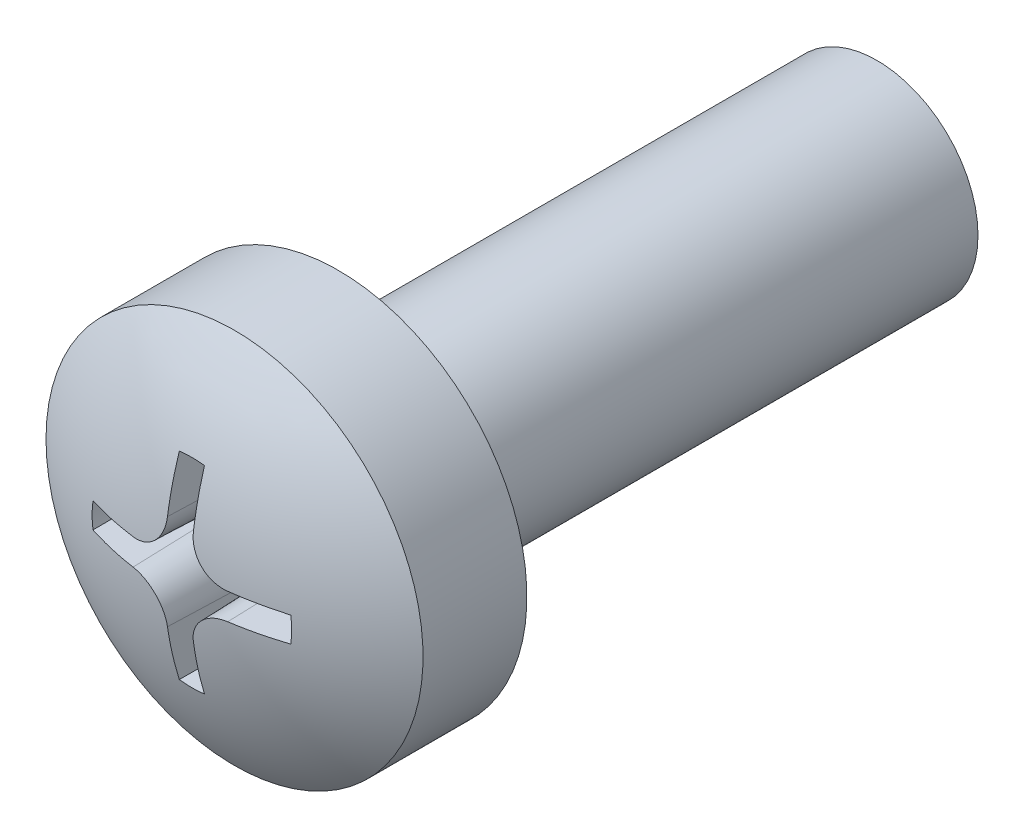
ISO-10303-21;
HEADER;
FILE_DESCRIPTION(('STEP AP214'),'2;1');
FILE_NAME('part.step','',(''),(''),'','','');
FILE_SCHEMA(('AUTOMOTIVE_DESIGN { 1 0 10303 214 1 1 1 1 }'));
ENDSEC;
DATA;
#1=APPLICATION_CONTEXT('core data for automotive mechanical design processes');
#2=APPLICATION_PROTOCOL_DEFINITION('international standard','automotive_design',2000,#1);
#3=PRODUCT_CONTEXT('',#1,'mechanical');
#4=PRODUCT('Part','Part','',(#3));
#5=PRODUCT_RELATED_PRODUCT_CATEGORY('part','',(#4));
#6=PRODUCT_DEFINITION_FORMATION('','',#4);
#7=PRODUCT_DEFINITION_CONTEXT('part definition',#1,'design');
#8=PRODUCT_DEFINITION('design','',#6,#7);
#9=PRODUCT_DEFINITION_SHAPE('','',#8);
#10=(LENGTH_UNIT() NAMED_UNIT(*) SI_UNIT(.MILLI.,.METRE.));
#11=(NAMED_UNIT(*) PLANE_ANGLE_UNIT() SI_UNIT($,.RADIAN.));
#12=(NAMED_UNIT(*) SI_UNIT($,.STERADIAN.) SOLID_ANGLE_UNIT());
#13=UNCERTAINTY_MEASURE_WITH_UNIT(LENGTH_MEASURE(1.E-05),#10,'distance_accuracy_value','');
#14=(GEOMETRIC_REPRESENTATION_CONTEXT(3) GLOBAL_UNCERTAINTY_ASSIGNED_CONTEXT((#13)) GLOBAL_UNIT_ASSIGNED_CONTEXT((#10,
#11,#12)) REPRESENTATION_CONTEXT('',''));
#15=CARTESIAN_POINT('',(0.,0.,0.));
#16=DIRECTION('',(0.,0.,1.));
#17=DIRECTION('',(1.,0.,0.));
#18=AXIS2_PLACEMENT_3D('',#15,#16,#17);
#19=CARTESIAN_POINT('',(0.,0.,8.));
#20=DIRECTION('',(0.,0.,-1.));
#21=DIRECTION('',(-1.,0.,0.));
#22=AXIS2_PLACEMENT_3D('',#19,#20,#21);
#23=CYLINDRICAL_SURFACE('',#22,1.5);
#24=CARTESIAN_POINT('',(0.,0.,8.));
#25=DIRECTION('',(0.,0.,1.));
#26=DIRECTION('',(1.,0.,0.));
#27=AXIS2_PLACEMENT_3D('',#24,#25,#26);
#28=CIRCLE('',#27,1.5);
#29=CARTESIAN_POINT('',(1.5,0.,8.));
#30=VERTEX_POINT('',#29);
#31=EDGE_CURVE('E206',#30,#30,#28,.T.);
#32=ORIENTED_EDGE('',*,*,#31,.F.);
#33=EDGE_LOOP('',(#32));
#34=FACE_BOUND('',#33,.T.);
#35=CARTESIAN_POINT('',(0.,0.,0.));
#36=DIRECTION('',(0.,0.,1.));
#37=DIRECTION('',(1.,0.,0.));
#38=AXIS2_PLACEMENT_3D('',#35,#36,#37);
#39=CIRCLE('',#38,1.5);
#40=CARTESIAN_POINT('',(1.5,0.,0.));
#41=VERTEX_POINT('',#40);
#42=EDGE_CURVE('E205',#41,#41,#39,.T.);
#43=ORIENTED_EDGE('',*,*,#42,.T.);
#44=EDGE_LOOP('',(#43));
#45=FACE_BOUND('',#44,.T.);
#46=ADVANCED_FACE('F34',(#34,#45),#23,.T.);
#47=CARTESIAN_POINT('',(0.,0.,0.));
#48=DIRECTION('',(0.,0.,1.));
#49=DIRECTION('',(1.,0.,0.));
#50=AXIS2_PLACEMENT_3D('',#47,#48,#49);
#51=PLANE('',#50);
#52=ORIENTED_EDGE('',*,*,#42,.F.);
#53=EDGE_LOOP('',(#52));
#54=FACE_BOUND('',#53,.T.);
#55=ADVANCED_FACE('F291',(#54),#51,.F.);
#56=CARTESIAN_POINT('',(0.,0.,8.));
#57=DIRECTION('',(0.,0.,-1.));
#58=DIRECTION('',(-1.,0.,0.));
#59=AXIS2_PLACEMENT_3D('',#56,#57,#58);
#60=PLANE('',#59);
#61=CARTESIAN_POINT('',(0.,0.,8.));
#62=DIRECTION('',(0.,0.,-1.));
#63=DIRECTION('',(-1.,0.,0.));
#64=AXIS2_PLACEMENT_3D('',#61,#62,#63);
#65=CIRCLE('',#64,2.79999990016222);
#66=CARTESIAN_POINT('',(-2.79999990016222,0.,8.));
#67=VERTEX_POINT('',#66);
#68=EDGE_CURVE('E202',#67,#67,#65,.T.);
#69=ORIENTED_EDGE('',*,*,#68,.T.);
#70=EDGE_LOOP('',(#69));
#71=FACE_BOUND('',#70,.T.);
#72=ORIENTED_EDGE('',*,*,#31,.T.);
#73=EDGE_LOOP('',(#72));
#74=FACE_BOUND('',#73,.T.);
#75=ADVANCED_FACE('F296',(#71,#74),#60,.T.);
#76=CARTESIAN_POINT('',(0.,0.,-0.393620134621003));
#77=DIRECTION('',(0.,0.,-1.));
#78=DIRECTION('',(-1.,0.,0.));
#79=AXIS2_PLACEMENT_3D('',#76,#77,#78);
#80=CYLINDRICAL_SURFACE('',#79,2.79999990016222);
#81=CARTESIAN_POINT('',(0.,0.,9.54246307978926));
#82=DIRECTION('',(0.,0.,-1.));
#83=DIRECTION('',(-1.,0.,0.));
#84=AXIS2_PLACEMENT_3D('',#81,#82,#83);
#85=CIRCLE('',#84,2.79999990016222);
#86=CARTESIAN_POINT('',(-2.79999990016222,0.,9.54246307978926));
#87=VERTEX_POINT('',#86);
#88=EDGE_CURVE('E150',#87,#87,#85,.T.);
#89=ORIENTED_EDGE('',*,*,#88,.T.);
#90=EDGE_LOOP('',(#89));
#91=FACE_BOUND('',#90,.T.);
#92=ORIENTED_EDGE('',*,*,#68,.F.);
#93=EDGE_LOOP('',(#92));
#94=FACE_BOUND('',#93,.T.);
#95=ADVANCED_FACE('F303',(#91,#94),#80,.T.);
#96=CARTESIAN_POINT('',(0.,0.,5.40000011175871));
#97=DIRECTION('',(0.,0.,-1.));
#98=DIRECTION('',(1.,0.,0.));
#99=AXIS2_PLACEMENT_3D('',#96,#97,#98);
#100=SPHERICAL_SURFACE('',#99,4.99999988824129);
#101=CARTESIAN_POINT('',(0.,0.,10.1754183821502));
#102=DIRECTION('',(0.,0.,-1.));
#103=DIRECTION('',(-1.,0.,0.));
#104=AXIS2_PLACEMENT_3D('',#101,#102,#103);
#105=CIRCLE('',#104,1.4816812157899);
#106=CARTESIAN_POINT('',(0.18668120666759,1.46987392394782,10.1754183821501));
#107=VERTEX_POINT('',#106);
#108=CARTESIAN_POINT('',(-0.186681206667593,1.46987392394782,10.1754183821501));
#109=VERTEX_POINT('',#108);
#110=EDGE_CURVE('E11',#107,#109,#105,.F.);
#111=ORIENTED_EDGE('',*,*,#110,.F.);
#112=CARTESIAN_POINT('',(0.0198956640512633,0.,5.39930533986049));
#113=DIRECTION('',(0.999390827019096,0.,-0.034899496702501));
#114=DIRECTION('',(-0.034899496702501,0.,-0.999390827019096));
#115=AXIS2_PLACEMENT_3D('',#112,#113,#114);
#116=CIRCLE('',#115,4.99996025606773);
#117=CARTESIAN_POINT('',(0.192632610704328,0.708178557647151,10.3458442955351));
#118=VERTEX_POINT('',#117);
#119=EDGE_CURVE('E41',#107,#118,#116,.T.);
#120=ORIENTED_EDGE('',*,*,#119,.T.);
#121=CARTESIAN_POINT('',(0.192631650862954,0.708378557647151,10.345815691475));
#122=CARTESIAN_POINT('',(0.192737639690806,0.679822741796073,10.3499041439734));
#123=CARTESIAN_POINT('',(0.195268867839181,0.651227392830896,10.3536463362414));
#124=CARTESIAN_POINT('',(0.205046889209158,0.59476703827459,10.3603460551712));
#125=CARTESIAN_POINT('',(0.212292618678018,0.566901869404939,10.3633037586285));
#126=CARTESIAN_POINT('',(0.231373694375068,0.51267267841366,10.3683466063254));
#127=CARTESIAN_POINT('',(0.24321326807329,0.486310064716558,10.3704309431667));
#128=CARTESIAN_POINT('',(0.271156607880554,0.435900324544809,10.3736603491012));
#129=CARTESIAN_POINT('',(0.287258672100205,0.411852279143786,10.3748057923215));
#130=CARTESIAN_POINT('',(0.323072075489885,0.367028886470806,10.3761158025717));
#131=CARTESIAN_POINT('',(0.342740648168188,0.346219679514825,10.3762912893596));
#132=CARTESIAN_POINT('',(0.385246757538768,0.30814670944778,10.3756853456951));
#133=CARTESIAN_POINT('',(0.408084792807392,0.290883505206881,10.3749037645383));
#134=CARTESIAN_POINT('',(0.456147210008961,0.260464262414973,10.3724133951705));
#135=CARTESIAN_POINT('',(0.481359759209805,0.247289131136679,10.3707090224733));
#136=CARTESIAN_POINT('',(0.533541444049374,0.225283958921734,10.3664258870809));
#137=CARTESIAN_POINT('',(0.560509920861877,0.216452298826715,10.3638474508254));
#138=CARTESIAN_POINT('',(0.606876295057338,0.205379627868596,10.3588207651558));
#139=CARTESIAN_POINT('',(0.626020977094074,0.201943221890059,10.3565812960749));
#140=CARTESIAN_POINT('',(0.66450204404321,0.197253494550336,10.3517582366185));
#141=CARTESIAN_POINT('',(0.683838077649067,0.195996727127303,10.349175196413));
#142=CARTESIAN_POINT('',(0.703167546290468,0.195835015722445,10.3464334662955));
#143=B_SPLINE_CURVE_WITH_KNOTS('',3,(#121,#122,#123,#124,#125,#126,#127,#128,#129,#130,#131,
#132,#133,#134,#135,#136,#137,#138,#139,#140,#141,#142),.UNSPECIFIED.,.F.,.F.,(4,2,2,2,2,2,2,2,
2,2,4),(0.,0.0864417829586744,0.172864068455127,0.259366073122684,0.345833591994609,
0.431325646912079,0.516831165542016,0.601931114274005,0.686999315371811,0.745618262708562,
0.804144447281415),.UNSPECIFIED.);
#144=CARTESIAN_POINT('',(0.702917362553185,0.19583721033533,10.3464689381926));
#145=VERTEX_POINT('',#144);
#146=EDGE_CURVE('E274',#118,#145,#143,.T.);
#147=ORIENTED_EDGE('',*,*,#146,.T.);
#148=CARTESIAN_POINT('',(0.00010539015335094,0.0259265633149154,5.39909472873738));
#149=DIRECTION('',(0.00406243901494415,0.999382570249833,-0.034899496702501));
#150=DIRECTION('',(0.,0.0348997846864301,0.999390816962434));
#151=AXIS2_PLACEMENT_3D('',#148,#149,#150);
#152=CIRCLE('',#151,4.99993258603575);
#153=CARTESIAN_POINT('',(1.46986565043204,0.186746338396853,10.1754183821502));
#154=VERTEX_POINT('',#153);
#155=EDGE_CURVE('E272',#154,#145,#152,.F.);
#156=ORIENTED_EDGE('',*,*,#155,.F.);
#157=CARTESIAN_POINT('',(0.,0.,10.1754183821502));
#158=DIRECTION('',(0.,0.,-1.));
#159=DIRECTION('',(-1.,0.,0.));
#160=AXIS2_PLACEMENT_3D('',#157,#158,#159);
#161=CIRCLE('',#160,1.4816812157899);
#162=CARTESIAN_POINT('',(1.46986565043204,-0.186746338396852,10.1754183821501));
#163=VERTEX_POINT('',#162);
#164=EDGE_CURVE('E270',#163,#154,#161,.F.);
#165=ORIENTED_EDGE('',*,*,#164,.F.);
#166=CARTESIAN_POINT('',(0.000105390153350971,-0.0259265633149169,5.39909472873738));
#167=DIRECTION('',(0.00406243901494512,-0.999382570249833,-0.034899496702501));
#168=DIRECTION('',(0.,0.0348997846864301,-0.999390816962434));
#169=AXIS2_PLACEMENT_3D('',#166,#167,#168);
#170=CIRCLE('',#169,4.99993258603575);
#171=CARTESIAN_POINT('',(0.702917362553185,-0.195837210335331,10.3464689381926));
#172=VERTEX_POINT('',#171);
#173=EDGE_CURVE('E267',#163,#172,#170,.T.);
#174=ORIENTED_EDGE('',*,*,#173,.T.);
#175=CARTESIAN_POINT('',(0.192631650862954,-0.708378557647152,10.345815691475));
#176=CARTESIAN_POINT('',(0.192737639690806,-0.679822741796074,10.3499041439734));
#177=CARTESIAN_POINT('',(0.195268867839181,-0.651227392830896,10.3536463362414));
#178=CARTESIAN_POINT('',(0.205046889209158,-0.59476703827459,10.3603460551712));
#179=CARTESIAN_POINT('',(0.212292618678018,-0.56690186940494,10.3633037586285));
#180=CARTESIAN_POINT('',(0.231373694375068,-0.512672678413661,10.3683466063254));
#181=CARTESIAN_POINT('',(0.24321326807329,-0.486310064716559,10.3704309431667));
#182=CARTESIAN_POINT('',(0.271156607880554,-0.435900324544809,10.3736603491012));
#183=CARTESIAN_POINT('',(0.287258672100205,-0.411852279143786,10.3748057923215));
#184=CARTESIAN_POINT('',(0.323072075489885,-0.367028886470807,10.3761158025717));
#185=CARTESIAN_POINT('',(0.342740648168188,-0.346219679514826,10.3762912893596));
#186=CARTESIAN_POINT('',(0.385246757538768,-0.308146709447781,10.3756853456951));
#187=CARTESIAN_POINT('',(0.408084792807392,-0.290883505206882,10.3749037645383));
#188=CARTESIAN_POINT('',(0.456147210008961,-0.260464262414974,10.3724133951705));
#189=CARTESIAN_POINT('',(0.481359759209805,-0.247289131136679,10.3707090224733));
#190=CARTESIAN_POINT('',(0.533541444049374,-0.225283958921735,10.3664258870809));
#191=CARTESIAN_POINT('',(0.560509920861878,-0.216452298826716,10.3638474508254));
#192=CARTESIAN_POINT('',(0.606876295057338,-0.205379627868597,10.3588207651558));
#193=CARTESIAN_POINT('',(0.626020977094074,-0.201943221890059,10.3565812960749));
#194=CARTESIAN_POINT('',(0.66450204404321,-0.197253494550336,10.3517582366185));
#195=CARTESIAN_POINT('',(0.683838077649067,-0.195996727127304,10.349175196413));
#196=CARTESIAN_POINT('',(0.703167546290467,-0.195835015722445,10.3464334662955));
#197=B_SPLINE_CURVE_WITH_KNOTS('',3,(#175,#176,#177,#178,#179,#180,#181,#182,#183,#184,#185,
#186,#187,#188,#189,#190,#191,#192,#193,#194,#195,#196),.UNSPECIFIED.,.F.,.F.,(4,2,2,2,2,2,2,2,
2,2,4),(0.,0.0864417829586745,0.172864068455127,0.259366073122684,0.345833591994609,
0.431325646912079,0.516831165542017,0.601931114274005,0.686999315371811,0.745618262708562,
0.804144447281414),.UNSPECIFIED.);
#198=CARTESIAN_POINT('',(0.192632610704328,-0.708178557647152,10.3458442955351));
#199=VERTEX_POINT('',#198);
#200=EDGE_CURVE('E262',#199,#172,#197,.T.);
#201=ORIENTED_EDGE('',*,*,#200,.F.);
#202=CARTESIAN_POINT('',(0.0198956640512633,0.,5.39930533986049));
#203=DIRECTION('',(0.999390827019096,0.,-0.034899496702501));
#204=DIRECTION('',(-0.034899496702501,0.,-0.999390827019096));
#205=AXIS2_PLACEMENT_3D('',#202,#203,#204);
#206=CIRCLE('',#205,4.99996025606773);
#207=CARTESIAN_POINT('',(0.186681206667591,-1.46987392394782,10.1754183821502));
#208=VERTEX_POINT('',#207);
#209=EDGE_CURVE('E260',#208,#199,#206,.F.);
#210=ORIENTED_EDGE('',*,*,#209,.F.);
#211=CARTESIAN_POINT('',(0.,0.,10.1754183821502));
#212=DIRECTION('',(0.,0.,-1.));
#213=DIRECTION('',(-1.,0.,0.));
#214=AXIS2_PLACEMENT_3D('',#211,#212,#213);
#215=CIRCLE('',#214,1.4816812157899);
#216=CARTESIAN_POINT('',(-0.186681206667593,-1.46987392394782,10.1754183821501));
#217=VERTEX_POINT('',#216);
#218=EDGE_CURVE('E257',#208,#217,#215,.T.);
#219=ORIENTED_EDGE('',*,*,#218,.T.);
#220=CARTESIAN_POINT('',(-0.0198956640512654,0.,5.39930533986049));
#221=DIRECTION('',(-0.999390827019096,0.,-0.034899496702501));
#222=DIRECTION('',(-0.034899496702501,0.,0.999390827019096));
#223=AXIS2_PLACEMENT_3D('',#220,#221,#222);
#224=CIRCLE('',#223,4.99996025606773);
#225=CARTESIAN_POINT('',(-0.19263261070433,-0.708178557647151,10.3458442955351));
#226=VERTEX_POINT('',#225);
#227=EDGE_CURVE('E253',#217,#226,#224,.T.);
#228=ORIENTED_EDGE('',*,*,#227,.T.);
#229=CARTESIAN_POINT('',(-0.70316754629047,-0.195835015722445,10.3464334662955));
#230=CARTESIAN_POINT('',(-0.674619447950853,-0.196052963217916,10.3504857241648));
#231=CARTESIAN_POINT('',(-0.64604143463723,-0.198695168407334,10.3541890416191));
#232=CARTESIAN_POINT('',(-0.589634494727846,-0.208689654905481,10.3608068014756));
#233=CARTESIAN_POINT('',(-0.561805393198953,-0.216040826152062,10.3637214295682));
#234=CARTESIAN_POINT('',(-0.50766612082123,-0.235323893103952,10.3686750861046));
#235=CARTESIAN_POINT('',(-0.481357369172765,-0.247259991703852,10.370713307523));
#236=CARTESIAN_POINT('',(-0.431071022991569,-0.275383990623327,10.3738489099634));
#237=CARTESIAN_POINT('',(-0.407092510169895,-0.291570206692358,10.3749466629444));
#238=CARTESIAN_POINT('',(-0.362416703115867,-0.327538701485094,10.3761618083202));
#239=CARTESIAN_POINT('',(-0.34168588735275,-0.347278991317759,10.376289966384));
#240=CARTESIAN_POINT('',(-0.303780328011577,-0.389912448398922,10.375590364716));
#241=CARTESIAN_POINT('',(-0.286606147147997,-0.412806113607388,10.3747624538554));
#242=CARTESIAN_POINT('',(-0.25636685808405,-0.460969475916929,10.3721816258056));
#243=CARTESIAN_POINT('',(-0.243283863198687,-0.486228184526672,10.3704328274806));
#244=CARTESIAN_POINT('',(-0.22146899790456,-0.538485231439468,10.366063898297));
#245=CARTESIAN_POINT('',(-0.212735526227358,-0.565482925398504,10.3634440886927));
#246=CARTESIAN_POINT('',(-0.201823996880683,-0.61191361527353,10.3583478129874));
#247=CARTESIAN_POINT('',(-0.198453223120025,-0.631098599357625,10.3560784464194));
#248=CARTESIAN_POINT('',(-0.193901764340931,-0.669652448873598,10.3511968730386));
#249=CARTESIAN_POINT('',(-0.192717622166763,-0.689020975292663,10.3485852144187));
#250=CARTESIAN_POINT('',(-0.192631650862956,-0.708378557647151,10.345815691475));
#251=B_SPLINE_CURVE_WITH_KNOTS('',3,(#229,#230,#231,#232,#233,#234,#235,#236,#237,#238,#239,
#240,#241,#242,#243,#244,#245,#246,#247,#248,#249,#250),.UNSPECIFIED.,.F.,.F.,(4,2,2,2,2,2,2,2,
2,2,4),(0.,0.086405343611419,0.172790326060609,0.259254685287909,0.34568483171133,
0.431153892876567,0.51663646625136,0.601739908197796,0.686811996276178,0.745524819849982,
0.804144736260156),.UNSPECIFIED.);
#252=CARTESIAN_POINT('',(-0.702917362553187,-0.195837210335331,10.3464689381926));
#253=VERTEX_POINT('',#252);
#254=EDGE_CURVE('E247',#253,#226,#251,.T.);
#255=ORIENTED_EDGE('',*,*,#254,.F.);
#256=CARTESIAN_POINT('',(-0.000105390153349066,-0.0259265633149168,5.39909472873738));
#257=DIRECTION('',(-0.0040624390149453,-0.999382570249833,-0.034899496702501));
#258=DIRECTION('',(0.,0.0348997846864301,-0.999390816962434));
#259=AXIS2_PLACEMENT_3D('',#256,#257,#258);
#260=CIRCLE('',#259,4.99993258603575);
#261=CARTESIAN_POINT('',(-1.46986565043204,-0.186746338396853,10.1754183821502));
#262=VERTEX_POINT('',#261);
#263=EDGE_CURVE('E254',#262,#253,#260,.F.);
#264=ORIENTED_EDGE('',*,*,#263,.F.);
#265=CARTESIAN_POINT('',(0.,0.,10.1754183821502));
#266=DIRECTION('',(0.,0.,-1.));
#267=DIRECTION('',(-1.,0.,0.));
#268=AXIS2_PLACEMENT_3D('',#265,#266,#267);
#269=CIRCLE('',#268,1.4816812157899);
#270=CARTESIAN_POINT('',(-1.46986565043204,0.186746338396852,10.1754183821501));
#271=VERTEX_POINT('',#270);
#272=EDGE_CURVE('E582',#262,#271,#269,.T.);
#273=ORIENTED_EDGE('',*,*,#272,.T.);
#274=CARTESIAN_POINT('',(-0.000105390153349066,0.0259265633149168,5.39909472873738));
#275=DIRECTION('',(-0.00406243901494529,0.999382570249833,-0.034899496702501));
#276=DIRECTION('',(0.,0.0348997846864301,0.999390816962434));
#277=AXIS2_PLACEMENT_3D('',#274,#275,#276);
#278=CIRCLE('',#277,4.99993258603575);
#279=CARTESIAN_POINT('',(-0.702917362553187,0.195837210335331,10.3464689381926));
#280=VERTEX_POINT('',#279);
#281=EDGE_CURVE('E220',#271,#280,#278,.T.);
#282=ORIENTED_EDGE('',*,*,#281,.T.);
#283=CARTESIAN_POINT('',(-0.192631650862955,0.708378557647151,10.345815691475));
#284=CARTESIAN_POINT('',(-0.192737639690808,0.679822741796074,10.3499041439734));
#285=CARTESIAN_POINT('',(-0.195268867839183,0.651227392830896,10.3536463362414));
#286=CARTESIAN_POINT('',(-0.20504688920916,0.59476703827459,10.3603460551712));
#287=CARTESIAN_POINT('',(-0.21229261867802,0.566901869404939,10.3633037586285));
#288=CARTESIAN_POINT('',(-0.231373694375069,0.51267267841366,10.3683466063254));
#289=CARTESIAN_POINT('',(-0.243213268073292,0.486310064716559,10.3704309431667));
#290=CARTESIAN_POINT('',(-0.271156607880555,0.435900324544809,10.3736603491012));
#291=CARTESIAN_POINT('',(-0.287258672100206,0.411852279143786,10.3748057923215));
#292=CARTESIAN_POINT('',(-0.323072075489887,0.367028886470806,10.3761158025717));
#293=CARTESIAN_POINT('',(-0.34274064816819,0.346219679514826,10.3762912893596));
#294=CARTESIAN_POINT('',(-0.38524675753877,0.30814670944778,10.3756853456951));
#295=CARTESIAN_POINT('',(-0.408084792807394,0.290883505206882,10.3749037645383));
#296=CARTESIAN_POINT('',(-0.456147210008963,0.260464262414974,10.3724133951705));
#297=CARTESIAN_POINT('',(-0.481359759209807,0.247289131136679,10.3707090224733));
#298=CARTESIAN_POINT('',(-0.533541444049376,0.225283958921735,10.3664258870809));
#299=CARTESIAN_POINT('',(-0.560509920861879,0.216452298826716,10.3638474508254));
#300=CARTESIAN_POINT('',(-0.60687629505734,0.205379627868597,10.3588207651558));
#301=CARTESIAN_POINT('',(-0.626020977094076,0.201943221890059,10.3565812960749));
#302=CARTESIAN_POINT('',(-0.664502044043212,0.197253494550336,10.3517582366185));
#303=CARTESIAN_POINT('',(-0.683838077649068,0.195996727127304,10.349175196413));
#304=CARTESIAN_POINT('',(-0.703167546290469,0.195835015722445,10.3464334662955));
#305=B_SPLINE_CURVE_WITH_KNOTS('',3,(#283,#284,#285,#286,#287,#288,#289,#290,#291,#292,#293,
#294,#295,#296,#297,#298,#299,#300,#301,#302,#303,#304),.UNSPECIFIED.,.F.,.F.,(4,2,2,2,2,2,2,2,
2,2,4),(0.,0.0864417829586746,0.172864068455127,0.259366073122684,0.345833591994609,
0.431325646912079,0.516831165542016,0.601931114274005,0.686999315371811,0.745618262708561,
0.804144447281414),.UNSPECIFIED.);
#306=CARTESIAN_POINT('',(-0.19263261070433,0.708178557647151,10.3458442955351));
#307=VERTEX_POINT('',#306);
#308=EDGE_CURVE('E213',#307,#280,#305,.T.);
#309=ORIENTED_EDGE('',*,*,#308,.F.);
#310=CARTESIAN_POINT('',(-0.0198956640512644,0.,5.39930533986049));
#311=DIRECTION('',(-0.999390827019096,0.,-0.034899496702501));
#312=DIRECTION('',(-0.034899496702501,0.,0.999390827019096));
#313=AXIS2_PLACEMENT_3D('',#310,#311,#312);
#314=CIRCLE('',#313,4.99996025606773);
#315=EDGE_CURVE('E209',#109,#307,#314,.F.);
#316=ORIENTED_EDGE('',*,*,#315,.F.);
#317=EDGE_LOOP('',(#111,#120,#147,#156,#165,#174,#201,#210,#219,#228,#255,#264,#273,#282,#309,#316));
#318=FACE_BOUND('',#317,.T.);
#319=ORIENTED_EDGE('',*,*,#88,.F.);
#320=EDGE_LOOP('',(#319));
#321=FACE_BOUND('',#320,.T.);
#322=ADVANCED_FACE('F222',(#318,#321),#100,.T.);
#323=CARTESIAN_POINT('',(0.,0.,10.7000001));
#324=DIRECTION('',(0.,0.,1.));
#325=DIRECTION('',(1.,0.,0.));
#326=AXIS2_PLACEMENT_3D('',#323,#324,#325);
#327=CONICAL_SURFACE('',#326,1.50000001303852,0.0349065850398867);
#328=ORIENTED_EDGE('',*,*,#110,.T.);
#329=CARTESIAN_POINT('',(-0.142142619910814,1.43009594495933,8.90000013091991));
#330=CARTESIAN_POINT('',(-0.152618658076336,1.43957885994155,9.19999461322929));
#331=CARTESIAN_POINT('',(-0.163094792502732,1.4489727928664,9.49999185208944));
#332=CARTESIAN_POINT('',(-0.184047253837866,1.46758269456637,10.0999918417828));
#333=CARTESIAN_POINT('',(-0.194523580746602,1.47679866334215,10.399994592616));
#334=CARTESIAN_POINT('',(-0.205000003916213,1.48592565006124,10.7000001));
#335=B_SPLINE_CURVE_WITH_KNOTS('',3,(#329,#330,#331,#332,#333,#334),.UNSPECIFIED.,.F.,.F.,(4,2,
4),(0.,0.900981158642231,1.80196231389533),.UNSPECIFIED.);
#336=CARTESIAN_POINT('',(-0.142142619910814,1.43009594495933,8.90000013091991));
#337=VERTEX_POINT('',#336);
#338=EDGE_CURVE('E48',#337,#109,#335,.T.);
#339=ORIENTED_EDGE('',*,*,#338,.F.);
#340=CARTESIAN_POINT('',(0.,0.,8.90000013091991));
#341=DIRECTION('',(0.,0.,1.));
#342=DIRECTION('',(1.,0.,0.));
#343=AXIS2_PLACEMENT_3D('',#340,#341,#342);
#344=CIRCLE('',#343,1.43714262903312);
#345=CARTESIAN_POINT('',(0.142142619910811,1.43009594495933,8.90000013091991));
#346=VERTEX_POINT('',#345);
#347=EDGE_CURVE('E158',#346,#337,#344,.T.);
#348=ORIENTED_EDGE('',*,*,#347,.F.);
#349=CARTESIAN_POINT('',(0.142142619910811,1.43009594495933,8.90000013091991));
#350=CARTESIAN_POINT('',(0.152618658076333,1.43957885994155,9.19999461322929));
#351=CARTESIAN_POINT('',(0.16309479250273,1.4489727928664,9.49999185208944));
#352=CARTESIAN_POINT('',(0.184047253837863,1.46758269456637,10.0999918417828));
#353=CARTESIAN_POINT('',(0.1945235807466,1.47679866334215,10.399994592616));
#354=CARTESIAN_POINT('',(0.205000003916211,1.48592565006124,10.7000001));
#355=B_SPLINE_CURVE_WITH_KNOTS('',3,(#349,#350,#351,#352,#353,#354),.UNSPECIFIED.,.F.,.F.,(4,2,
4),(0.,0.900981158642231,1.80196231389533),.UNSPECIFIED.);
#356=EDGE_CURVE('E142',#346,#107,#355,.T.);
#357=ORIENTED_EDGE('',*,*,#356,.T.);
#358=EDGE_LOOP('',(#328,#339,#348,#357));
#359=FACE_BOUND('',#358,.T.);
#360=ADVANCED_FACE('F162',(#359),#327,.F.);
#361=CARTESIAN_POINT('',(0.205000003916211,1.48592565006124,10.7000001));
#362=DIRECTION('',(0.999390827019096,0.,-0.034899496702501));
#363=DIRECTION('',(-0.034899496702501,0.,-0.999390827019096));
#364=AXIS2_PLACEMENT_3D('',#361,#362,#363);
#365=PLANE('',#364);
#366=ORIENTED_EDGE('',*,*,#356,.F.);
#367=DIRECTION('',(0.,1.,0.));
#368=VECTOR('',#367,1.);
#369=CARTESIAN_POINT('',(0.142142619910812,0.,8.90000013091991));
#370=LINE('',#369,#368);
#371=CARTESIAN_POINT('',(0.142142619910811,0.708178557647151,8.90000013091991));
#372=VERTEX_POINT('',#371);
#373=EDGE_CURVE('E145',#346,#372,#370,.F.);
#374=ORIENTED_EDGE('',*,*,#373,.T.);
#375=DIRECTION('',(0.034899496702501,0.,0.999390827019096));
#376=VECTOR('',#375,1.);
#377=CARTESIAN_POINT('',(0.20500000391621,0.708178557647151,10.7000001));
#378=LINE('',#377,#376);
#379=EDGE_CURVE('E151',#372,#118,#378,.T.);
#380=ORIENTED_EDGE('',*,*,#379,.T.);
#381=ORIENTED_EDGE('',*,*,#119,.F.);
#382=EDGE_LOOP('',(#366,#374,#380,#381));
#383=FACE_BOUND('',#382,.T.);
#384=ADVANCED_FACE('F144',(#383),#365,.F.);
#385=CARTESIAN_POINT('',(0.705000003916211,0.708178557647151,10.7000001));
#386=DIRECTION('',(0.,0.,-1.));
#387=DIRECTION('',(1.,0.,0.));
#388=AXIS2_PLACEMENT_3D('',#385,#386,#387);
#389=CONICAL_SURFACE('',#388,0.5,0.0349065850398867);
#390=ORIENTED_EDGE('',*,*,#379,.F.);
#391=CARTESIAN_POINT('',(0.705000003916211,0.708178557647151,8.90000013091991));
#392=DIRECTION('',(0.,0.,1.));
#393=DIRECTION('',(1.,0.,0.));
#394=AXIS2_PLACEMENT_3D('',#391,#392,#393);
#395=CIRCLE('',#394,0.562857384005399);
#396=CARTESIAN_POINT('',(0.702712036351556,0.145325823858085,8.90000013091991));
#397=VERTEX_POINT('',#396);
#398=EDGE_CURVE('E160',#372,#397,#395,.T.);
#399=ORIENTED_EDGE('',*,*,#398,.T.);
#400=DIRECTION('',(0.000141863496415148,0.0348992083697649,0.999390827019096));
#401=VECTOR('',#400,1.);
#402=CARTESIAN_POINT('',(0.702967546290468,0.208182688548215,10.7000001));
#403=LINE('',#402,#401);
#404=EDGE_CURVE('E409',#397,#145,#403,.T.);
#405=ORIENTED_EDGE('',*,*,#404,.T.);
#406=ORIENTED_EDGE('',*,*,#146,.F.);
#407=EDGE_LOOP('',(#390,#399,#405,#406));
#408=FACE_BOUND('',#407,.T.);
#409=ADVANCED_FACE('F279',(#408),#389,.T.);
#410=CARTESIAN_POINT('',(1.48592565006123,0.205000003916213,10.7000001));
#411=DIRECTION('',(0.00406243901494415,0.999382570249833,-0.034899496702501));
#412=DIRECTION('',(0.,0.0348997846864301,0.999390816962434));
#413=AXIS2_PLACEMENT_3D('',#410,#411,#412);
#414=PLANE('',#413);
#415=ORIENTED_EDGE('',*,*,#155,.T.);
#416=ORIENTED_EDGE('',*,*,#404,.F.);
#417=DIRECTION('',(-0.99999173819787,0.00406491525148502,0.));
#418=VECTOR('',#417,1.);
#419=CARTESIAN_POINT('',(0.000602343564913371,0.148179863836023,8.90000013091991));
#420=LINE('',#419,#418);
#421=CARTESIAN_POINT('',(1.43007341244828,0.142369137079488,8.90000013091991));
#422=VERTEX_POINT('',#421);
#423=EDGE_CURVE('E171',#422,#397,#420,.T.);
#424=ORIENTED_EDGE('',*,*,#423,.F.);
#425=CARTESIAN_POINT('',(1.43007341244828,0.142369137079488,8.90000013091991));
#426=CARTESIAN_POINT('',(1.43955869120937,0.152806706922151,9.19999467904414));
#427=CARTESIAN_POINT('',(1.44895568373278,0.163244730756208,9.49999195080733));
#428=CARTESIAN_POINT('',(1.46757309626977,0.184121686368453,10.0999919405007));
#429=CARTESIAN_POINT('',(1.47679351628402,0.194560618146638,10.3999946584309));
#430=CARTESIAN_POINT('',(1.48592565006123,0.205000003916213,10.7000001));
#431=B_SPLINE_CURVE_WITH_KNOTS('',3,(#425,#426,#427,#428,#429,#430),.UNSPECIFIED.,.F.,.F.,(4,2,
4),(0.,0.900977563471273,1.80195512360615),.UNSPECIFIED.);
#432=EDGE_CURVE('E404',#422,#154,#431,.T.);
#433=ORIENTED_EDGE('',*,*,#432,.T.);
#434=EDGE_LOOP('',(#415,#416,#424,#433));
#435=FACE_BOUND('',#434,.T.);
#436=ADVANCED_FACE('F234',(#435),#414,.F.);
#437=CARTESIAN_POINT('',(0.,0.,10.7000001));
#438=DIRECTION('',(0.,0.,1.));
#439=DIRECTION('',(1.,0.,0.));
#440=AXIS2_PLACEMENT_3D('',#437,#438,#439);
#441=CONICAL_SURFACE('',#440,1.50000001303852,0.0349065850398867);
#442=ORIENTED_EDGE('',*,*,#164,.T.);
#443=ORIENTED_EDGE('',*,*,#432,.F.);
#444=CARTESIAN_POINT('',(0.,0.,8.90000013091991));
#445=DIRECTION('',(0.,0.,1.));
#446=DIRECTION('',(1.,0.,0.));
#447=AXIS2_PLACEMENT_3D('',#444,#445,#446);
#448=CIRCLE('',#447,1.43714262903312);
#449=CARTESIAN_POINT('',(1.43007341244828,-0.142369137079488,8.90000013091991));
#450=VERTEX_POINT('',#449);
#451=EDGE_CURVE('E173',#450,#422,#448,.T.);
#452=ORIENTED_EDGE('',*,*,#451,.F.);
#453=CARTESIAN_POINT('',(1.43007341244828,-0.142369137079488,8.90000013091991));
#454=CARTESIAN_POINT('',(1.43955869120937,-0.152806706922151,9.19999467904414));
#455=CARTESIAN_POINT('',(1.44895568373278,-0.163244730756208,9.49999195080733));
#456=CARTESIAN_POINT('',(1.46757309626977,-0.184121686368453,10.0999919405007));
#457=CARTESIAN_POINT('',(1.47679351628402,-0.194560618146638,10.3999946584309));
#458=CARTESIAN_POINT('',(1.48592565006123,-0.205000003916213,10.7000001));
#459=B_SPLINE_CURVE_WITH_KNOTS('',3,(#453,#454,#455,#456,#457,#458),.UNSPECIFIED.,.F.,.F.,(4,2,
4),(0.,0.900977563471273,1.80195512360615),.UNSPECIFIED.);
#460=EDGE_CURVE('E399',#450,#163,#459,.T.);
#461=ORIENTED_EDGE('',*,*,#460,.T.);
#462=EDGE_LOOP('',(#442,#443,#452,#461));
#463=FACE_BOUND('',#462,.T.);
#464=ADVANCED_FACE('F287',(#463),#441,.F.);
#465=CARTESIAN_POINT('',(1.48592565006123,-0.205000003916213,10.7000001));
#466=DIRECTION('',(0.00406243901494512,-0.999382570249833,-0.034899496702501));
#467=DIRECTION('',(0.,0.0348997846864301,-0.999390816962434));
#468=AXIS2_PLACEMENT_3D('',#465,#466,#467);
#469=PLANE('',#468);
#470=ORIENTED_EDGE('',*,*,#460,.F.);
#471=DIRECTION('',(0.99999173819787,0.00406491525148599,0.));
#472=VECTOR('',#471,1.);
#473=CARTESIAN_POINT('',(0.00060234356491352,-0.148179863836024,8.90000013091991));
#474=LINE('',#473,#472);
#475=CARTESIAN_POINT('',(0.702712036351556,-0.145325823858086,8.90000013091991));
#476=VERTEX_POINT('',#475);
#477=EDGE_CURVE('E176',#450,#476,#474,.F.);
#478=ORIENTED_EDGE('',*,*,#477,.T.);
#479=DIRECTION('',(0.000141863496415188,-0.0348992083697649,0.999390827019096));
#480=VECTOR('',#479,1.);
#481=CARTESIAN_POINT('',(0.702967546290468,-0.208182688548216,10.7000001));
#482=LINE('',#481,#480);
#483=EDGE_CURVE('E419',#476,#172,#482,.T.);
#484=ORIENTED_EDGE('',*,*,#483,.T.);
#485=ORIENTED_EDGE('',*,*,#173,.F.);
#486=EDGE_LOOP('',(#470,#478,#484,#485));
#487=FACE_BOUND('',#486,.T.);
#488=ADVANCED_FACE('F394',(#487),#469,.F.);
#489=CARTESIAN_POINT('',(0.705000003916211,-0.708178557647152,10.7000001));
#490=DIRECTION('',(0.,0.,-1.));
#491=DIRECTION('',(-1.,0.,0.));
#492=AXIS2_PLACEMENT_3D('',#489,#490,#491);
#493=CONICAL_SURFACE('',#492,0.5,0.0349065850398867);
#494=ORIENTED_EDGE('',*,*,#200,.T.);
#495=ORIENTED_EDGE('',*,*,#483,.F.);
#496=CARTESIAN_POINT('',(0.705000003916211,-0.708178557647152,8.90000013091991));
#497=DIRECTION('',(0.,0.,1.));
#498=DIRECTION('',(1.,0.,0.));
#499=AXIS2_PLACEMENT_3D('',#496,#497,#498);
#500=CIRCLE('',#499,0.562857384005399);
#501=CARTESIAN_POINT('',(0.142142619910812,-0.708178557647152,8.90000013091991));
#502=VERTEX_POINT('',#501);
#503=EDGE_CURVE('E178',#502,#476,#500,.F.);
#504=ORIENTED_EDGE('',*,*,#503,.F.);
#505=DIRECTION('',(0.034899496702501,0.,0.999390827019096));
#506=VECTOR('',#505,1.);
#507=CARTESIAN_POINT('',(0.205000003916211,-0.708178557647152,10.7000001));
#508=LINE('',#507,#506);
#509=EDGE_CURVE('E385',#502,#199,#508,.T.);
#510=ORIENTED_EDGE('',*,*,#509,.T.);
#511=EDGE_LOOP('',(#494,#495,#504,#510));
#512=FACE_BOUND('',#511,.T.);
#513=ADVANCED_FACE('F244',(#512),#493,.T.);
#514=CARTESIAN_POINT('',(0.205000003916211,-1.48592565006124,10.7000001));
#515=DIRECTION('',(0.999390827019096,0.,-0.034899496702501));
#516=DIRECTION('',(-0.034899496702501,0.,-0.999390827019096));
#517=AXIS2_PLACEMENT_3D('',#514,#515,#516);
#518=PLANE('',#517);
#519=ORIENTED_EDGE('',*,*,#209,.T.);
#520=ORIENTED_EDGE('',*,*,#509,.F.);
#521=DIRECTION('',(0.,1.,0.));
#522=VECTOR('',#521,1.);
#523=CARTESIAN_POINT('',(0.142142619910812,0.,8.90000013091991));
#524=LINE('',#523,#522);
#525=CARTESIAN_POINT('',(0.142142619910811,-1.43009594495933,8.90000013091991));
#526=VERTEX_POINT('',#525);
#527=EDGE_CURVE('E181',#526,#502,#524,.T.);
#528=ORIENTED_EDGE('',*,*,#527,.F.);
#529=CARTESIAN_POINT('',(0.142142619910811,-1.43009594495933,8.90000013091991));
#530=CARTESIAN_POINT('',(0.152618658076333,-1.43957885994155,9.19999461322929));
#531=CARTESIAN_POINT('',(0.16309479250273,-1.4489727928664,9.49999185208944));
#532=CARTESIAN_POINT('',(0.184047253837863,-1.46758269456637,10.0999918417828));
#533=CARTESIAN_POINT('',(0.1945235807466,-1.47679866334215,10.399994592616));
#534=CARTESIAN_POINT('',(0.205000003916211,-1.48592565006124,10.7000001));
#535=B_SPLINE_CURVE_WITH_KNOTS('',3,(#529,#530,#531,#532,#533,#534),.UNSPECIFIED.,.F.,.F.,(4,2,
4),(0.,0.900981158642231,1.80196231389533),.UNSPECIFIED.);
#536=EDGE_CURVE('E378',#526,#208,#535,.T.);
#537=ORIENTED_EDGE('',*,*,#536,.T.);
#538=EDGE_LOOP('',(#519,#520,#528,#537));
#539=FACE_BOUND('',#538,.T.);
#540=ADVANCED_FACE('F387',(#539),#518,.F.);
#541=CARTESIAN_POINT('',(0.,0.,10.7000001));
#542=DIRECTION('',(0.,0.,1.));
#543=DIRECTION('',(-1.,0.,0.));
#544=AXIS2_PLACEMENT_3D('',#541,#542,#543);
#545=CONICAL_SURFACE('',#544,1.50000001303852,0.0349065850398867);
#546=ORIENTED_EDGE('',*,*,#536,.F.);
#547=CARTESIAN_POINT('',(0.,0.,8.90000013091991));
#548=DIRECTION('',(0.,0.,1.));
#549=DIRECTION('',(1.,0.,0.));
#550=AXIS2_PLACEMENT_3D('',#547,#548,#549);
#551=CIRCLE('',#550,1.43714262903312);
#552=CARTESIAN_POINT('',(-0.142142619910814,-1.43009594495933,8.90000013091991));
#553=VERTEX_POINT('',#552);
#554=EDGE_CURVE('E184',#526,#553,#551,.F.);
#555=ORIENTED_EDGE('',*,*,#554,.T.);
#556=CARTESIAN_POINT('',(-0.142142619910814,-1.43009594495933,8.90000013091991));
#557=CARTESIAN_POINT('',(-0.152618658076336,-1.43957885994155,9.19999461322929));
#558=CARTESIAN_POINT('',(-0.163094792502732,-1.4489727928664,9.49999185208944));
#559=CARTESIAN_POINT('',(-0.184047253837866,-1.46758269456637,10.0999918417828));
#560=CARTESIAN_POINT('',(-0.194523580746602,-1.47679866334215,10.399994592616));
#561=CARTESIAN_POINT('',(-0.205000003916213,-1.48592565006124,10.7000001));
#562=B_SPLINE_CURVE_WITH_KNOTS('',3,(#556,#557,#558,#559,#560,#561),.UNSPECIFIED.,.F.,.F.,(4,2,
4),(0.,0.900981158642231,1.80196231389533),.UNSPECIFIED.);
#563=EDGE_CURVE('E371',#553,#217,#562,.T.);
#564=ORIENTED_EDGE('',*,*,#563,.T.);
#565=ORIENTED_EDGE('',*,*,#218,.F.);
#566=EDGE_LOOP('',(#546,#555,#564,#565));
#567=FACE_BOUND('',#566,.T.);
#568=ADVANCED_FACE('F366',(#567),#545,.F.);
#569=CARTESIAN_POINT('',(-0.205000003916213,-1.48592565006124,10.7000001));
#570=DIRECTION('',(-0.999390827019096,0.,-0.034899496702501));
#571=DIRECTION('',(-0.034899496702501,0.,0.999390827019096));
#572=AXIS2_PLACEMENT_3D('',#569,#570,#571);
#573=PLANE('',#572);
#574=ORIENTED_EDGE('',*,*,#563,.F.);
#575=DIRECTION('',(0.,-1.,0.));
#576=VECTOR('',#575,1.);
#577=CARTESIAN_POINT('',(-0.142142619910814,0.,8.90000013091991));
#578=LINE('',#577,#576);
#579=CARTESIAN_POINT('',(-0.142142619910814,-0.708178557647151,8.90000013091991));
#580=VERTEX_POINT('',#579);
#581=EDGE_CURVE('E186',#553,#580,#578,.F.);
#582=ORIENTED_EDGE('',*,*,#581,.T.);
#583=DIRECTION('',(-0.034899496702501,0.,0.999390827019096));
#584=VECTOR('',#583,1.);
#585=CARTESIAN_POINT('',(-0.205000003916213,-0.708178557647151,10.7000001));
#586=LINE('',#585,#584);
#587=EDGE_CURVE('E379',#580,#226,#586,.T.);
#588=ORIENTED_EDGE('',*,*,#587,.T.);
#589=ORIENTED_EDGE('',*,*,#227,.F.);
#590=EDGE_LOOP('',(#574,#582,#588,#589));
#591=FACE_BOUND('',#590,.T.);
#592=ADVANCED_FACE('F242',(#591),#573,.F.);
#593=CARTESIAN_POINT('',(-0.705000003916213,-0.708178557647151,10.7000001));
#594=DIRECTION('',(0.,0.,-1.));
#595=DIRECTION('',(-1.,0.,0.));
#596=AXIS2_PLACEMENT_3D('',#593,#594,#595);
#597=CONICAL_SURFACE('',#596,0.5,0.0349065850398867);
#598=ORIENTED_EDGE('',*,*,#254,.T.);
#599=ORIENTED_EDGE('',*,*,#587,.F.);
#600=CARTESIAN_POINT('',(-0.705000003916213,-0.708178557647151,8.90000013091991));
#601=DIRECTION('',(0.,0.,1.));
#602=DIRECTION('',(1.,0.,0.));
#603=AXIS2_PLACEMENT_3D('',#600,#601,#602);
#604=CIRCLE('',#603,0.562857384005399);
#605=CARTESIAN_POINT('',(-0.702712036351558,-0.145325823858086,8.90000013091991));
#606=VERTEX_POINT('',#605);
#607=EDGE_CURVE('E188',#606,#580,#604,.F.);
#608=ORIENTED_EDGE('',*,*,#607,.F.);
#609=DIRECTION('',(-0.000141863496415188,-0.0348992083697649,0.999390827019096));
#610=VECTOR('',#609,1.);
#611=CARTESIAN_POINT('',(-0.70296754629047,-0.208182688548216,10.7000001));
#612=LINE('',#611,#610);
#613=EDGE_CURVE('E574',#606,#253,#612,.T.);
#614=ORIENTED_EDGE('',*,*,#613,.T.);
#615=EDGE_LOOP('',(#598,#599,#608,#614));
#616=FACE_BOUND('',#615,.T.);
#617=ADVANCED_FACE('F237',(#616),#597,.T.);
#618=CARTESIAN_POINT('',(-1.48592565006124,-0.205000003916213,10.7000001));
#619=DIRECTION('',(-0.0040624390149453,-0.999382570249833,-0.034899496702501));
#620=DIRECTION('',(0.,0.0348997846864301,-0.999390816962434));
#621=AXIS2_PLACEMENT_3D('',#618,#619,#620);
#622=PLANE('',#621);
#623=ORIENTED_EDGE('',*,*,#263,.T.);
#624=ORIENTED_EDGE('',*,*,#613,.F.);
#625=DIRECTION('',(0.99999173819787,-0.00406491525148617,0.));
#626=VECTOR('',#625,1.);
#627=CARTESIAN_POINT('',(-0.000602343564913546,-0.148179863836024,8.90000013091991));
#628=LINE('',#627,#626);
#629=CARTESIAN_POINT('',(-1.43007341244828,-0.142369137079487,8.90000013091991));
#630=VERTEX_POINT('',#629);
#631=EDGE_CURVE('E191',#630,#606,#628,.T.);
#632=ORIENTED_EDGE('',*,*,#631,.F.);
#633=CARTESIAN_POINT('',(-1.43007341244828,-0.142369137079487,8.90000013091991));
#634=CARTESIAN_POINT('',(-1.43955869120937,-0.152806706922151,9.19999467904414));
#635=CARTESIAN_POINT('',(-1.44895568373278,-0.163244730756207,9.49999195080733));
#636=CARTESIAN_POINT('',(-1.46757309626978,-0.184121686368453,10.0999919405007));
#637=CARTESIAN_POINT('',(-1.47679351628402,-0.194560618146638,10.3999946584309));
#638=CARTESIAN_POINT('',(-1.48592565006124,-0.205000003916213,10.7000001));
#639=B_SPLINE_CURVE_WITH_KNOTS('',3,(#633,#634,#635,#636,#637,#638),.UNSPECIFIED.,.F.,.F.,(4,2,
4),(0.,0.900977563471273,1.80195512360615),.UNSPECIFIED.);
#640=EDGE_CURVE('E347',#630,#262,#639,.T.);
#641=ORIENTED_EDGE('',*,*,#640,.T.);
#642=EDGE_LOOP('',(#623,#624,#632,#641));
#643=FACE_BOUND('',#642,.T.);
#644=ADVANCED_FACE('F241',(#643),#622,.F.);
#645=CARTESIAN_POINT('',(0.,0.,10.7000001));
#646=DIRECTION('',(0.,0.,1.));
#647=DIRECTION('',(-1.,0.,0.));
#648=AXIS2_PLACEMENT_3D('',#645,#646,#647);
#649=CONICAL_SURFACE('',#648,1.50000001303852,0.0349065850398867);
#650=ORIENTED_EDGE('',*,*,#640,.F.);
#651=CARTESIAN_POINT('',(0.,0.,8.90000013091991));
#652=DIRECTION('',(0.,0.,1.));
#653=DIRECTION('',(1.,0.,0.));
#654=AXIS2_PLACEMENT_3D('',#651,#652,#653);
#655=CIRCLE('',#654,1.43714262903312);
#656=CARTESIAN_POINT('',(-1.43007341244828,0.142369137079487,8.90000013091991));
#657=VERTEX_POINT('',#656);
#658=EDGE_CURVE('E194',#630,#657,#655,.F.);
#659=ORIENTED_EDGE('',*,*,#658,.T.);
#660=CARTESIAN_POINT('',(-1.43007341244828,0.142369137079487,8.90000013091991));
#661=CARTESIAN_POINT('',(-1.43955869120937,0.152806706922151,9.19999467904414));
#662=CARTESIAN_POINT('',(-1.44895568373278,0.163244730756207,9.49999195080733));
#663=CARTESIAN_POINT('',(-1.46757309626978,0.184121686368453,10.0999919405007));
#664=CARTESIAN_POINT('',(-1.47679351628402,0.194560618146638,10.3999946584309));
#665=CARTESIAN_POINT('',(-1.48592565006124,0.205000003916213,10.7000001));
#666=B_SPLINE_CURVE_WITH_KNOTS('',3,(#660,#661,#662,#663,#664,#665),.UNSPECIFIED.,.F.,.F.,(4,2,
4),(0.,0.900977563471273,1.80195512360615),.UNSPECIFIED.);
#667=EDGE_CURVE('E332',#657,#271,#666,.T.);
#668=ORIENTED_EDGE('',*,*,#667,.T.);
#669=ORIENTED_EDGE('',*,*,#272,.F.);
#670=EDGE_LOOP('',(#650,#659,#668,#669));
#671=FACE_BOUND('',#670,.T.);
#672=ADVANCED_FACE('F354',(#671),#649,.F.);
#673=CARTESIAN_POINT('',(-1.48592565006124,0.205000003916213,10.7000001));
#674=DIRECTION('',(-0.00406243901494529,0.999382570249833,-0.034899496702501));
#675=DIRECTION('',(0.,0.0348997846864301,0.999390816962434));
#676=AXIS2_PLACEMENT_3D('',#673,#674,#675);
#677=PLANE('',#676);
#678=ORIENTED_EDGE('',*,*,#667,.F.);
#679=DIRECTION('',(-0.99999173819787,-0.00406491525148616,0.));
#680=VECTOR('',#679,1.);
#681=CARTESIAN_POINT('',(-0.000602343564913545,0.148179863836024,8.90000013091991));
#682=LINE('',#681,#680);
#683=CARTESIAN_POINT('',(-0.702712036351557,0.145325823858086,8.90000013091991));
#684=VERTEX_POINT('',#683);
#685=EDGE_CURVE('E196',#657,#684,#682,.F.);
#686=ORIENTED_EDGE('',*,*,#685,.T.);
#687=DIRECTION('',(-0.000141863496415188,0.0348992083697649,0.999390827019096));
#688=VECTOR('',#687,1.);
#689=CARTESIAN_POINT('',(-0.702967546290469,0.208182688548216,10.7000001));
#690=LINE('',#689,#688);
#691=EDGE_CURVE('E330',#684,#280,#690,.T.);
#692=ORIENTED_EDGE('',*,*,#691,.T.);
#693=ORIENTED_EDGE('',*,*,#281,.F.);
#694=EDGE_LOOP('',(#678,#686,#692,#693));
#695=FACE_BOUND('',#694,.T.);
#696=ADVANCED_FACE('F232',(#695),#677,.F.);
#697=CARTESIAN_POINT('',(-0.705000003916212,0.708178557647151,10.7000001));
#698=DIRECTION('',(0.,0.,-1.));
#699=DIRECTION('',(-1.,0.,0.));
#700=AXIS2_PLACEMENT_3D('',#697,#698,#699);
#701=CONICAL_SURFACE('',#700,0.5,0.0349065850398867);
#702=ORIENTED_EDGE('',*,*,#308,.T.);
#703=ORIENTED_EDGE('',*,*,#691,.F.);
#704=CARTESIAN_POINT('',(-0.705000003916212,0.708178557647151,8.90000013091991));
#705=DIRECTION('',(0.,0.,1.));
#706=DIRECTION('',(1.,0.,0.));
#707=AXIS2_PLACEMENT_3D('',#704,#705,#706);
#708=CIRCLE('',#707,0.562857384005399);
#709=CARTESIAN_POINT('',(-0.142142619910813,0.708178557647151,8.90000013091991));
#710=VERTEX_POINT('',#709);
#711=EDGE_CURVE('E165',#710,#684,#708,.F.);
#712=ORIENTED_EDGE('',*,*,#711,.F.);
#713=DIRECTION('',(-0.034899496702501,0.,0.999390827019096));
#714=VECTOR('',#713,1.);
#715=CARTESIAN_POINT('',(-0.205000003916212,0.708178557647151,10.7000001));
#716=LINE('',#715,#714);
#717=EDGE_CURVE('E326',#710,#307,#716,.T.);
#718=ORIENTED_EDGE('',*,*,#717,.T.);
#719=EDGE_LOOP('',(#702,#703,#712,#718));
#720=FACE_BOUND('',#719,.T.);
#721=ADVANCED_FACE('F226',(#720),#701,.T.);
#722=CARTESIAN_POINT('',(-0.205000003916213,1.48592565006124,10.7000001));
#723=DIRECTION('',(-0.999390827019096,0.,-0.034899496702501));
#724=DIRECTION('',(-0.034899496702501,0.,0.999390827019096));
#725=AXIS2_PLACEMENT_3D('',#722,#723,#724);
#726=PLANE('',#725);
#727=ORIENTED_EDGE('',*,*,#315,.T.);
#728=ORIENTED_EDGE('',*,*,#717,.F.);
#729=DIRECTION('',(0.,-1.,0.));
#730=VECTOR('',#729,1.);
#731=CARTESIAN_POINT('',(-0.142142619910813,0.,8.90000013091991));
#732=LINE('',#731,#730);
#733=EDGE_CURVE('E163',#337,#710,#732,.T.);
#734=ORIENTED_EDGE('',*,*,#733,.F.);
#735=ORIENTED_EDGE('',*,*,#338,.T.);
#736=EDGE_LOOP('',(#727,#728,#734,#735));
#737=FACE_BOUND('',#736,.T.);
#738=ADVANCED_FACE('F231',(#737),#726,.F.);
#739=CARTESIAN_POINT('',(0.,0.,8.90000013091991));
#740=DIRECTION('',(0.,0.,1.));
#741=DIRECTION('',(1.,0.,0.));
#742=AXIS2_PLACEMENT_3D('',#739,#740,#741);
#743=PLANE('',#742);
#744=ORIENTED_EDGE('',*,*,#347,.T.);
#745=ORIENTED_EDGE('',*,*,#733,.T.);
#746=ORIENTED_EDGE('',*,*,#711,.T.);
#747=ORIENTED_EDGE('',*,*,#685,.F.);
#748=ORIENTED_EDGE('',*,*,#658,.F.);
#749=ORIENTED_EDGE('',*,*,#631,.T.);
#750=ORIENTED_EDGE('',*,*,#607,.T.);
#751=ORIENTED_EDGE('',*,*,#581,.F.);
#752=ORIENTED_EDGE('',*,*,#554,.F.);
#753=ORIENTED_EDGE('',*,*,#527,.T.);
#754=ORIENTED_EDGE('',*,*,#503,.T.);
#755=ORIENTED_EDGE('',*,*,#477,.F.);
#756=ORIENTED_EDGE('',*,*,#451,.T.);
#757=ORIENTED_EDGE('',*,*,#423,.T.);
#758=ORIENTED_EDGE('',*,*,#398,.F.);
#759=ORIENTED_EDGE('',*,*,#373,.F.);
#760=EDGE_LOOP('',(#744,#745,#746,#747,#748,#749,#750,#751,#752,#753,#754,#755,#756,#757,#758,#759));
#761=FACE_BOUND('',#760,.T.);
#762=ADVANCED_FACE('F156',(#761),#743,.T.);
#763=CLOSED_SHELL('',(#46,#55,#75,#95,#322,#360,#384,#409,#436,#464,#488,#513,#540,#568,#592,
#617,#644,#672,#696,#721,#738,#762));
#764=MANIFOLD_SOLID_BREP('B2',#763);
#765=ADVANCED_BREP_SHAPE_REPRESENTATION('',(#18,#764),#14);
#766=SHAPE_DEFINITION_REPRESENTATION(#9,#765);
ENDSEC;
END-ISO-10303-21;
